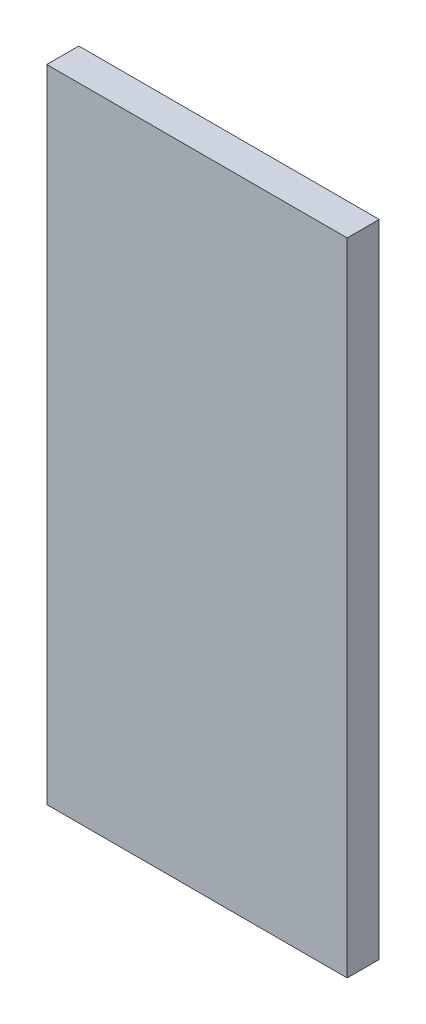
ISO-10303-21;
HEADER;
FILE_DESCRIPTION(('STEP AP214'),'2;1');
FILE_NAME('part.step','',(''),(''),'','','');
FILE_SCHEMA(('AUTOMOTIVE_DESIGN { 1 0 10303 214 1 1 1 1 }'));
ENDSEC;
DATA;
#1=APPLICATION_CONTEXT('core data for automotive mechanical design processes');
#2=APPLICATION_PROTOCOL_DEFINITION('international standard','automotive_design',2000,#1);
#3=PRODUCT_CONTEXT('',#1,'mechanical');
#4=PRODUCT('Part','Part','',(#3));
#5=PRODUCT_RELATED_PRODUCT_CATEGORY('part','',(#4));
#6=PRODUCT_DEFINITION_FORMATION('','',#4);
#7=PRODUCT_DEFINITION_CONTEXT('part definition',#1,'design');
#8=PRODUCT_DEFINITION('design','',#6,#7);
#9=PRODUCT_DEFINITION_SHAPE('','',#8);
#10=(LENGTH_UNIT() NAMED_UNIT(*) SI_UNIT(.MILLI.,.METRE.));
#11=(NAMED_UNIT(*) PLANE_ANGLE_UNIT() SI_UNIT($,.RADIAN.));
#12=(NAMED_UNIT(*) SI_UNIT($,.STERADIAN.) SOLID_ANGLE_UNIT());
#13=UNCERTAINTY_MEASURE_WITH_UNIT(LENGTH_MEASURE(1.E-05),#10,'distance_accuracy_value','');
#14=(GEOMETRIC_REPRESENTATION_CONTEXT(3) GLOBAL_UNCERTAINTY_ASSIGNED_CONTEXT((#13)) GLOBAL_UNIT_ASSIGNED_CONTEXT((#10,
#11,#12)) REPRESENTATION_CONTEXT('',''));
#15=CARTESIAN_POINT('',(0.,0.,0.));
#16=DIRECTION('',(0.,0.,1.));
#17=DIRECTION('',(1.,0.,0.));
#18=AXIS2_PLACEMENT_3D('',#15,#16,#17);
#19=CARTESIAN_POINT('',(0.,0.,-8.00000000000001));
#20=DIRECTION('',(-1.,0.,0.));
#21=DIRECTION('',(0.,-1.,0.));
#22=AXIS2_PLACEMENT_3D('',#19,#20,#21);
#23=PLANE('',#22);
#24=DIRECTION('',(0.,-1.,0.));
#25=VECTOR('',#24,1.);
#26=CARTESIAN_POINT('',(0.,0.,0.));
#27=LINE('',#26,#25);
#28=CARTESIAN_POINT('',(0.,0.,0.));
#29=VERTEX_POINT('',#28);
#30=CARTESIAN_POINT('',(0.,-160.,0.));
#31=VERTEX_POINT('',#30);
#32=EDGE_CURVE('E96',#29,#31,#27,.T.);
#33=ORIENTED_EDGE('',*,*,#32,.F.);
#34=DIRECTION('',(0.,0.,1.));
#35=VECTOR('',#34,1.);
#36=CARTESIAN_POINT('',(0.,0.,-8.00000000000001));
#37=LINE('',#36,#35);
#38=CARTESIAN_POINT('',(0.,0.,-8.00000000000001));
#39=VERTEX_POINT('',#38);
#40=EDGE_CURVE('E11',#39,#29,#37,.T.);
#41=ORIENTED_EDGE('',*,*,#40,.F.);
#42=DIRECTION('',(0.,-1.,0.));
#43=VECTOR('',#42,1.);
#44=CARTESIAN_POINT('',(0.,0.,-8.00000000000001));
#45=LINE('',#44,#43);
#46=CARTESIAN_POINT('',(0.,-160.,-8.00000000000001));
#47=VERTEX_POINT('',#46);
#48=EDGE_CURVE('E90',#39,#47,#45,.T.);
#49=ORIENTED_EDGE('',*,*,#48,.T.);
#50=DIRECTION('',(0.,0.,1.));
#51=VECTOR('',#50,1.);
#52=CARTESIAN_POINT('',(0.,-160.,-8.00000000000001));
#53=LINE('',#52,#51);
#54=EDGE_CURVE('E35',#47,#31,#53,.T.);
#55=ORIENTED_EDGE('',*,*,#54,.T.);
#56=EDGE_LOOP('',(#33,#41,#49,#55));
#57=FACE_BOUND('',#56,.T.);
#58=ADVANCED_FACE('F32',(#57),#23,.T.);
#59=CARTESIAN_POINT('',(0.,0.,-8.00000000000001));
#60=DIRECTION('',(0.,1.,0.));
#61=DIRECTION('',(0.,0.,1.));
#62=AXIS2_PLACEMENT_3D('',#59,#60,#61);
#63=PLANE('',#62);
#64=DIRECTION('',(-1.,0.,0.));
#65=VECTOR('',#64,1.);
#66=CARTESIAN_POINT('',(0.,0.,0.));
#67=LINE('',#66,#65);
#68=CARTESIAN_POINT('',(75.,0.,0.));
#69=VERTEX_POINT('',#68);
#70=EDGE_CURVE('E92',#69,#29,#67,.T.);
#71=ORIENTED_EDGE('',*,*,#70,.F.);
#72=DIRECTION('',(0.,0.,1.));
#73=VECTOR('',#72,1.);
#74=CARTESIAN_POINT('',(75.,0.,-8.00000000000001));
#75=LINE('',#74,#73);
#76=CARTESIAN_POINT('',(75.,0.,-8.00000000000001));
#77=VERTEX_POINT('',#76);
#78=EDGE_CURVE('E41',#77,#69,#75,.T.);
#79=ORIENTED_EDGE('',*,*,#78,.F.);
#80=DIRECTION('',(-1.,0.,0.));
#81=VECTOR('',#80,1.);
#82=CARTESIAN_POINT('',(0.,0.,-8.00000000000001));
#83=LINE('',#82,#81);
#84=EDGE_CURVE('E87',#77,#39,#83,.T.);
#85=ORIENTED_EDGE('',*,*,#84,.T.);
#86=ORIENTED_EDGE('',*,*,#40,.T.);
#87=EDGE_LOOP('',(#71,#79,#85,#86));
#88=FACE_BOUND('',#87,.T.);
#89=ADVANCED_FACE('F106',(#88),#63,.T.);
#90=CARTESIAN_POINT('',(75.,0.,-8.00000000000001));
#91=DIRECTION('',(1.,0.,0.));
#92=DIRECTION('',(0.,1.,0.));
#93=AXIS2_PLACEMENT_3D('',#90,#91,#92);
#94=PLANE('',#93);
#95=DIRECTION('',(0.,1.,0.));
#96=VECTOR('',#95,1.);
#97=CARTESIAN_POINT('',(75.,0.,0.));
#98=LINE('',#97,#96);
#99=CARTESIAN_POINT('',(75.0000000000001,-160.,0.));
#100=VERTEX_POINT('',#99);
#101=EDGE_CURVE('E82',#100,#69,#98,.T.);
#102=ORIENTED_EDGE('',*,*,#101,.F.);
#103=DIRECTION('',(0.,0.,1.));
#104=VECTOR('',#103,1.);
#105=CARTESIAN_POINT('',(75.0000000000001,-160.,-8.00000000000001));
#106=LINE('',#105,#104);
#107=CARTESIAN_POINT('',(75.0000000000001,-160.,-8.00000000000001));
#108=VERTEX_POINT('',#107);
#109=EDGE_CURVE('E77',#108,#100,#106,.T.);
#110=ORIENTED_EDGE('',*,*,#109,.F.);
#111=DIRECTION('',(0.,1.,0.));
#112=VECTOR('',#111,1.);
#113=CARTESIAN_POINT('',(75.,0.,-8.00000000000001));
#114=LINE('',#113,#112);
#115=EDGE_CURVE('E80',#108,#77,#114,.T.);
#116=ORIENTED_EDGE('',*,*,#115,.T.);
#117=ORIENTED_EDGE('',*,*,#78,.T.);
#118=EDGE_LOOP('',(#102,#110,#116,#117));
#119=FACE_BOUND('',#118,.T.);
#120=ADVANCED_FACE('F79',(#119),#94,.T.);
#121=CARTESIAN_POINT('',(0.,-160.,-8.00000000000001));
#122=DIRECTION('',(0.,-1.,0.));
#123=DIRECTION('',(0.,0.,-1.));
#124=AXIS2_PLACEMENT_3D('',#121,#122,#123);
#125=PLANE('',#124);
#126=DIRECTION('',(1.,0.,0.));
#127=VECTOR('',#126,1.);
#128=CARTESIAN_POINT('',(0.,-160.,0.));
#129=LINE('',#128,#127);
#130=EDGE_CURVE('E99',#31,#100,#129,.T.);
#131=ORIENTED_EDGE('',*,*,#130,.F.);
#132=ORIENTED_EDGE('',*,*,#54,.F.);
#133=DIRECTION('',(1.,0.,0.));
#134=VECTOR('',#133,1.);
#135=CARTESIAN_POINT('',(0.,-160.,-8.00000000000001));
#136=LINE('',#135,#134);
#137=EDGE_CURVE('E86',#47,#108,#136,.T.);
#138=ORIENTED_EDGE('',*,*,#137,.T.);
#139=ORIENTED_EDGE('',*,*,#109,.T.);
#140=EDGE_LOOP('',(#131,#132,#138,#139));
#141=FACE_BOUND('',#140,.T.);
#142=ADVANCED_FACE('F89',(#141),#125,.T.);
#143=CARTESIAN_POINT('',(0.,0.,-8.00000000000001));
#144=DIRECTION('',(0.,0.,1.));
#145=DIRECTION('',(1.,0.,0.));
#146=AXIS2_PLACEMENT_3D('',#143,#144,#145);
#147=PLANE('',#146);
#148=ORIENTED_EDGE('',*,*,#48,.F.);
#149=ORIENTED_EDGE('',*,*,#84,.F.);
#150=ORIENTED_EDGE('',*,*,#115,.F.);
#151=ORIENTED_EDGE('',*,*,#137,.F.);
#152=EDGE_LOOP('',(#148,#149,#150,#151));
#153=FACE_BOUND('',#152,.T.);
#154=ADVANCED_FACE('F85',(#153),#147,.F.);
#155=CARTESIAN_POINT('',(0.,0.,0.));
#156=DIRECTION('',(0.,0.,1.));
#157=DIRECTION('',(1.,0.,0.));
#158=AXIS2_PLACEMENT_3D('',#155,#156,#157);
#159=PLANE('',#158);
#160=ORIENTED_EDGE('',*,*,#32,.T.);
#161=ORIENTED_EDGE('',*,*,#130,.T.);
#162=ORIENTED_EDGE('',*,*,#101,.T.);
#163=ORIENTED_EDGE('',*,*,#70,.T.);
#164=EDGE_LOOP('',(#160,#161,#162,#163));
#165=FACE_BOUND('',#164,.T.);
#166=ADVANCED_FACE('F105',(#165),#159,.T.);
#167=CLOSED_SHELL('',(#58,#89,#120,#142,#154,#166));
#168=MANIFOLD_SOLID_BREP('B2',#167);
#169=ADVANCED_BREP_SHAPE_REPRESENTATION('',(#18,#168),#14);
#170=SHAPE_DEFINITION_REPRESENTATION(#9,#169);
ENDSEC;
END-ISO-10303-21;
